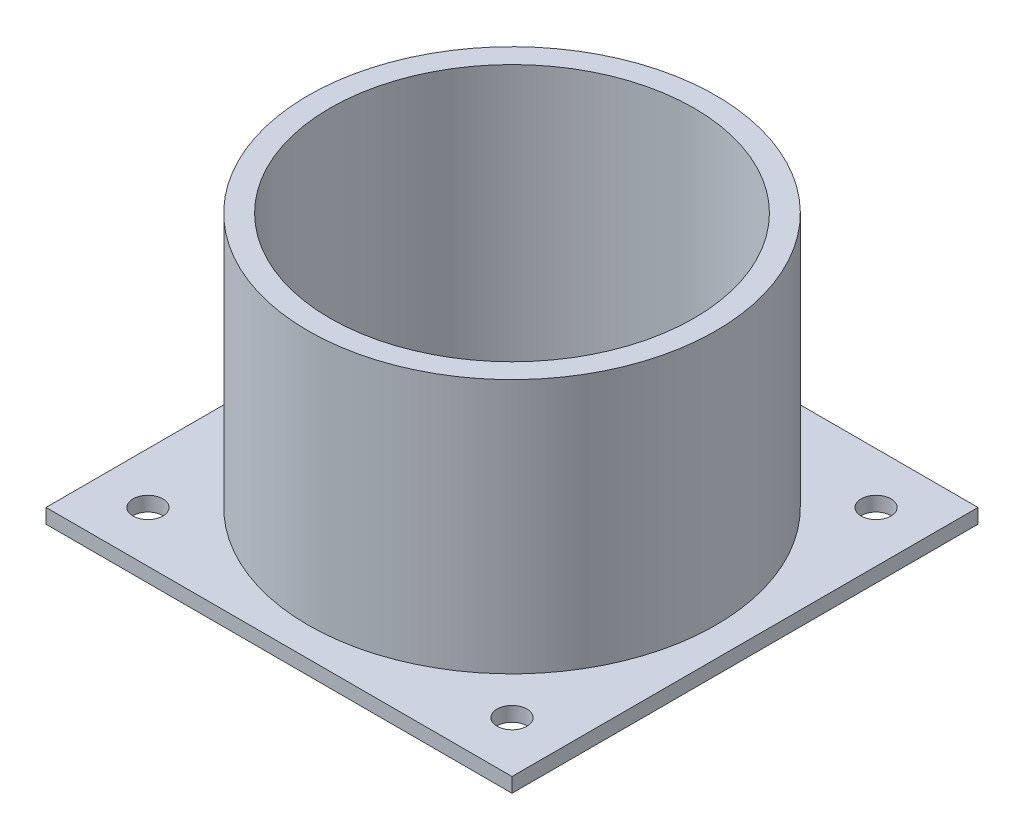
ISO-10303-21;
HEADER;
FILE_DESCRIPTION(('STEP AP214'),'2;1');
FILE_NAME('part.step','',(''),(''),'','','');
FILE_SCHEMA(('AUTOMOTIVE_DESIGN { 1 0 10303 214 1 1 1 1 }'));
ENDSEC;
DATA;
#1=APPLICATION_CONTEXT('core data for automotive mechanical design processes');
#2=APPLICATION_PROTOCOL_DEFINITION('international standard','automotive_design',2000,#1);
#3=PRODUCT_CONTEXT('',#1,'mechanical');
#4=PRODUCT('Part','Part','',(#3));
#5=PRODUCT_RELATED_PRODUCT_CATEGORY('part','',(#4));
#6=PRODUCT_DEFINITION_FORMATION('','',#4);
#7=PRODUCT_DEFINITION_CONTEXT('part definition',#1,'design');
#8=PRODUCT_DEFINITION('design','',#6,#7);
#9=PRODUCT_DEFINITION_SHAPE('','',#8);
#10=(LENGTH_UNIT() NAMED_UNIT(*) SI_UNIT(.MILLI.,.METRE.));
#11=(NAMED_UNIT(*) PLANE_ANGLE_UNIT() SI_UNIT($,.RADIAN.));
#12=(NAMED_UNIT(*) SI_UNIT($,.STERADIAN.) SOLID_ANGLE_UNIT());
#13=UNCERTAINTY_MEASURE_WITH_UNIT(LENGTH_MEASURE(1.E-05),#10,'distance_accuracy_value','');
#14=(GEOMETRIC_REPRESENTATION_CONTEXT(3) GLOBAL_UNCERTAINTY_ASSIGNED_CONTEXT((#13)) GLOBAL_UNIT_ASSIGNED_CONTEXT((#10,
#11,#12)) REPRESENTATION_CONTEXT('',''));
#15=CARTESIAN_POINT('',(0.,0.,0.));
#16=DIRECTION('',(0.,0.,1.));
#17=DIRECTION('',(1.,0.,0.));
#18=AXIS2_PLACEMENT_3D('',#15,#16,#17);
#19=CARTESIAN_POINT('',(0.,2.,0.));
#20=DIRECTION('',(0.,1.,0.));
#21=DIRECTION('',(0.,0.,1.));
#22=AXIS2_PLACEMENT_3D('',#19,#20,#21);
#23=PLANE('',#22);
#24=DIRECTION('',(0.,0.,1.));
#25=VECTOR('',#24,1.);
#26=CARTESIAN_POINT('',(-23.9240506329114,2.,-18.7160940325497));
#27=LINE('',#26,#25);
#28=CARTESIAN_POINT('',(-23.9240506329114,2.,-18.7160940325497));
#29=VERTEX_POINT('',#28);
#30=CARTESIAN_POINT('',(-23.9240506329114,2.,45.2839059674503));
#31=VERTEX_POINT('',#30);
#32=EDGE_CURVE('E116',#29,#31,#27,.T.);
#33=ORIENTED_EDGE('',*,*,#32,.T.);
#34=DIRECTION('',(1.,0.,0.));
#35=VECTOR('',#34,1.);
#36=CARTESIAN_POINT('',(-23.9240506329114,2.,45.2839059674503));
#37=LINE('',#36,#35);
#38=CARTESIAN_POINT('',(40.0759493670886,2.,45.2839059674503));
#39=VERTEX_POINT('',#38);
#40=EDGE_CURVE('E111',#31,#39,#37,.T.);
#41=ORIENTED_EDGE('',*,*,#40,.T.);
#42=DIRECTION('',(0.,0.,-1.));
#43=VECTOR('',#42,1.);
#44=CARTESIAN_POINT('',(40.0759493670886,2.,-18.7160940325497));
#45=LINE('',#44,#43);
#46=CARTESIAN_POINT('',(40.0759493670886,2.,-18.7160940325497));
#47=VERTEX_POINT('',#46);
#48=EDGE_CURVE('E114',#39,#47,#45,.T.);
#49=ORIENTED_EDGE('',*,*,#48,.T.);
#50=DIRECTION('',(-1.,0.,0.));
#51=VECTOR('',#50,1.);
#52=CARTESIAN_POINT('',(-23.9240506329114,2.,-18.7160940325497));
#53=LINE('',#52,#51);
#54=EDGE_CURVE('E81',#47,#29,#53,.T.);
#55=ORIENTED_EDGE('',*,*,#54,.T.);
#56=EDGE_LOOP('',(#33,#41,#49,#55));
#57=FACE_BOUND('',#56,.T.);
#58=CARTESIAN_POINT('',(-16.9240506329114,2.,-11.7160940325497));
#59=DIRECTION('',(0.,1.,0.));
#60=DIRECTION('',(0.,0.,1.));
#61=AXIS2_PLACEMENT_3D('',#58,#59,#60);
#62=CIRCLE('',#61,2.05);
#63=CARTESIAN_POINT('',(-16.9240506329114,2.,-9.66609403254968));
#64=VERTEX_POINT('',#63);
#65=EDGE_CURVE('E153',#64,#64,#62,.T.);
#66=ORIENTED_EDGE('',*,*,#65,.F.);
#67=EDGE_LOOP('',(#66));
#68=FACE_BOUND('',#67,.T.);
#69=CARTESIAN_POINT('',(33.0759493670886,2.,38.2839059674503));
#70=DIRECTION('',(0.,1.,0.));
#71=DIRECTION('',(0.,0.,1.));
#72=AXIS2_PLACEMENT_3D('',#69,#70,#71);
#73=CIRCLE('',#72,2.04999999999999);
#74=CARTESIAN_POINT('',(33.0759493670886,2.,40.3339059674503));
#75=VERTEX_POINT('',#74);
#76=EDGE_CURVE('E177',#75,#75,#73,.T.);
#77=ORIENTED_EDGE('',*,*,#76,.F.);
#78=EDGE_LOOP('',(#77));
#79=FACE_BOUND('',#78,.T.);
#80=CARTESIAN_POINT('',(33.0759493670886,2.,-11.7160940325497));
#81=DIRECTION('',(0.,1.,0.));
#82=DIRECTION('',(0.,0.,1.));
#83=AXIS2_PLACEMENT_3D('',#80,#81,#82);
#84=CIRCLE('',#83,2.04999999999999);
#85=CARTESIAN_POINT('',(33.0759493670886,2.,-9.6660940325497));
#86=VERTEX_POINT('',#85);
#87=EDGE_CURVE('E172',#86,#86,#84,.T.);
#88=ORIENTED_EDGE('',*,*,#87,.F.);
#89=EDGE_LOOP('',(#88));
#90=FACE_BOUND('',#89,.T.);
#91=CARTESIAN_POINT('',(-16.9240506329114,2.,38.2839059674503));
#92=DIRECTION('',(0.,1.,0.));
#93=DIRECTION('',(0.,0.,1.));
#94=AXIS2_PLACEMENT_3D('',#91,#92,#93);
#95=CIRCLE('',#94,2.05);
#96=CARTESIAN_POINT('',(-16.9240506329114,2.,40.3339059674503));
#97=VERTEX_POINT('',#96);
#98=EDGE_CURVE('E157',#97,#97,#95,.T.);
#99=ORIENTED_EDGE('',*,*,#98,.F.);
#100=EDGE_LOOP('',(#99));
#101=FACE_BOUND('',#100,.T.);
#102=CARTESIAN_POINT('',(8.07594936708862,2.,13.2839059674503));
#103=DIRECTION('',(0.,1.,0.));
#104=DIRECTION('',(0.,0.,1.));
#105=AXIS2_PLACEMENT_3D('',#102,#103,#104);
#106=CIRCLE('',#105,28.);
#107=CARTESIAN_POINT('',(8.07594936708862,2.,41.2839059674503));
#108=VERTEX_POINT('',#107);
#109=EDGE_CURVE('E189',#108,#108,#106,.T.);
#110=ORIENTED_EDGE('',*,*,#109,.F.);
#111=EDGE_LOOP('',(#110));
#112=FACE_BOUND('',#111,.T.);
#113=ADVANCED_FACE('F63',(#57,#68,#79,#90,#101,#112),#23,.T.);
#114=CARTESIAN_POINT('',(-23.9240506329114,2.,-18.7160940325497));
#115=DIRECTION('',(1.,0.,0.));
#116=DIRECTION('',(0.,0.,-1.));
#117=AXIS2_PLACEMENT_3D('',#114,#115,#116);
#118=PLANE('',#117);
#119=DIRECTION('',(0.,0.,1.));
#120=VECTOR('',#119,1.);
#121=CARTESIAN_POINT('',(-23.9240506329114,0.,-18.7160940325497));
#122=LINE('',#121,#120);
#123=CARTESIAN_POINT('',(-23.9240506329114,0.,-18.7160940325497));
#124=VERTEX_POINT('',#123);
#125=CARTESIAN_POINT('',(-23.9240506329114,0.,45.2839059674503));
#126=VERTEX_POINT('',#125);
#127=EDGE_CURVE('E132',#124,#126,#122,.T.);
#128=ORIENTED_EDGE('',*,*,#127,.T.);
#129=DIRECTION('',(0.,-1.,0.));
#130=VECTOR('',#129,1.);
#131=CARTESIAN_POINT('',(-23.9240506329114,2.,45.2839059674503));
#132=LINE('',#131,#130);
#133=EDGE_CURVE('E12',#31,#126,#132,.T.);
#134=ORIENTED_EDGE('',*,*,#133,.F.);
#135=ORIENTED_EDGE('',*,*,#32,.F.);
#136=DIRECTION('',(0.,-1.,0.));
#137=VECTOR('',#136,1.);
#138=CARTESIAN_POINT('',(-23.9240506329114,2.,-18.7160940325497));
#139=LINE('',#138,#137);
#140=EDGE_CURVE('E128',#29,#124,#139,.T.);
#141=ORIENTED_EDGE('',*,*,#140,.T.);
#142=EDGE_LOOP('',(#128,#134,#135,#141));
#143=FACE_BOUND('',#142,.T.);
#144=ADVANCED_FACE('F65',(#143),#118,.F.);
#145=CARTESIAN_POINT('',(-23.9240506329114,2.,45.2839059674503));
#146=DIRECTION('',(0.,0.,-1.));
#147=DIRECTION('',(-1.,0.,0.));
#148=AXIS2_PLACEMENT_3D('',#145,#146,#147);
#149=PLANE('',#148);
#150=DIRECTION('',(1.,0.,0.));
#151=VECTOR('',#150,1.);
#152=CARTESIAN_POINT('',(-23.9240506329114,0.,45.2839059674503));
#153=LINE('',#152,#151);
#154=CARTESIAN_POINT('',(40.0759493670886,0.,45.2839059674503));
#155=VERTEX_POINT('',#154);
#156=EDGE_CURVE('E121',#126,#155,#153,.T.);
#157=ORIENTED_EDGE('',*,*,#156,.T.);
#158=DIRECTION('',(0.,-1.,0.));
#159=VECTOR('',#158,1.);
#160=CARTESIAN_POINT('',(40.0759493670886,2.,45.2839059674503));
#161=LINE('',#160,#159);
#162=EDGE_CURVE('E73',#39,#155,#161,.T.);
#163=ORIENTED_EDGE('',*,*,#162,.F.);
#164=ORIENTED_EDGE('',*,*,#40,.F.);
#165=ORIENTED_EDGE('',*,*,#133,.T.);
#166=EDGE_LOOP('',(#157,#163,#164,#165));
#167=FACE_BOUND('',#166,.T.);
#168=ADVANCED_FACE('F120',(#167),#149,.F.);
#169=CARTESIAN_POINT('',(40.0759493670886,2.,-18.7160940325497));
#170=DIRECTION('',(-1.,0.,0.));
#171=DIRECTION('',(0.,0.,1.));
#172=AXIS2_PLACEMENT_3D('',#169,#170,#171);
#173=PLANE('',#172);
#174=DIRECTION('',(0.,0.,-1.));
#175=VECTOR('',#174,1.);
#176=CARTESIAN_POINT('',(40.0759493670886,0.,-18.7160940325497));
#177=LINE('',#176,#175);
#178=CARTESIAN_POINT('',(40.0759493670886,0.,-18.7160940325497));
#179=VERTEX_POINT('',#178);
#180=EDGE_CURVE('E98',#155,#179,#177,.T.);
#181=ORIENTED_EDGE('',*,*,#180,.T.);
#182=DIRECTION('',(0.,-1.,0.));
#183=VECTOR('',#182,1.);
#184=CARTESIAN_POINT('',(40.0759493670886,2.,-18.7160940325497));
#185=LINE('',#184,#183);
#186=EDGE_CURVE('E123',#47,#179,#185,.T.);
#187=ORIENTED_EDGE('',*,*,#186,.F.);
#188=ORIENTED_EDGE('',*,*,#48,.F.);
#189=ORIENTED_EDGE('',*,*,#162,.T.);
#190=EDGE_LOOP('',(#181,#187,#188,#189));
#191=FACE_BOUND('',#190,.T.);
#192=ADVANCED_FACE('F124',(#191),#173,.F.);
#193=CARTESIAN_POINT('',(-23.9240506329114,2.,-18.7160940325497));
#194=DIRECTION('',(0.,0.,1.));
#195=DIRECTION('',(1.,0.,0.));
#196=AXIS2_PLACEMENT_3D('',#193,#194,#195);
#197=PLANE('',#196);
#198=DIRECTION('',(-1.,0.,0.));
#199=VECTOR('',#198,1.);
#200=CARTESIAN_POINT('',(-23.9240506329114,0.,-18.7160940325497));
#201=LINE('',#200,#199);
#202=EDGE_CURVE('E104',#179,#124,#201,.T.);
#203=ORIENTED_EDGE('',*,*,#202,.T.);
#204=ORIENTED_EDGE('',*,*,#140,.F.);
#205=ORIENTED_EDGE('',*,*,#54,.F.);
#206=ORIENTED_EDGE('',*,*,#186,.T.);
#207=EDGE_LOOP('',(#203,#204,#205,#206));
#208=FACE_BOUND('',#207,.T.);
#209=ADVANCED_FACE('F146',(#208),#197,.F.);
#210=CARTESIAN_POINT('',(0.,0.,0.));
#211=DIRECTION('',(0.,1.,0.));
#212=DIRECTION('',(0.,0.,1.));
#213=AXIS2_PLACEMENT_3D('',#210,#211,#212);
#214=PLANE('',#213);
#215=CARTESIAN_POINT('',(8.07594936708862,0.,13.2839059674503));
#216=DIRECTION('',(0.,1.,0.));
#217=DIRECTION('',(0.,0.,1.));
#218=AXIS2_PLACEMENT_3D('',#215,#216,#217);
#219=CIRCLE('',#218,25.);
#220=CARTESIAN_POINT('',(8.07594936708862,0.,38.2839059674503));
#221=VERTEX_POINT('',#220);
#222=EDGE_CURVE('E165',#221,#221,#219,.T.);
#223=ORIENTED_EDGE('',*,*,#222,.T.);
#224=EDGE_LOOP('',(#223));
#225=FACE_BOUND('',#224,.T.);
#226=CARTESIAN_POINT('',(-16.9240506329114,0.,38.2839059674503));
#227=DIRECTION('',(0.,1.,0.));
#228=DIRECTION('',(0.,0.,1.));
#229=AXIS2_PLACEMENT_3D('',#226,#227,#228);
#230=CIRCLE('',#229,2.05);
#231=CARTESIAN_POINT('',(-16.9240506329114,0.,40.3339059674503));
#232=VERTEX_POINT('',#231);
#233=EDGE_CURVE('E161',#232,#232,#230,.T.);
#234=ORIENTED_EDGE('',*,*,#233,.T.);
#235=EDGE_LOOP('',(#234));
#236=FACE_BOUND('',#235,.T.);
#237=CARTESIAN_POINT('',(33.0759493670886,0.,-11.7160940325497));
#238=DIRECTION('',(0.,1.,0.));
#239=DIRECTION('',(0.,0.,1.));
#240=AXIS2_PLACEMENT_3D('',#237,#238,#239);
#241=CIRCLE('',#240,2.04999999999999);
#242=CARTESIAN_POINT('',(33.0759493670886,0.,-9.6660940325497));
#243=VERTEX_POINT('',#242);
#244=EDGE_CURVE('E182',#243,#243,#241,.T.);
#245=ORIENTED_EDGE('',*,*,#244,.T.);
#246=EDGE_LOOP('',(#245));
#247=FACE_BOUND('',#246,.T.);
#248=CARTESIAN_POINT('',(33.0759493670886,0.,38.2839059674503));
#249=DIRECTION('',(0.,1.,0.));
#250=DIRECTION('',(0.,0.,1.));
#251=AXIS2_PLACEMENT_3D('',#248,#249,#250);
#252=CIRCLE('',#251,2.04999999999999);
#253=CARTESIAN_POINT('',(33.0759493670886,0.,40.3339059674503));
#254=VERTEX_POINT('',#253);
#255=EDGE_CURVE('E173',#254,#254,#252,.T.);
#256=ORIENTED_EDGE('',*,*,#255,.T.);
#257=EDGE_LOOP('',(#256));
#258=FACE_BOUND('',#257,.T.);
#259=CARTESIAN_POINT('',(-16.9240506329114,0.,-11.7160940325497));
#260=DIRECTION('',(0.,1.,0.));
#261=DIRECTION('',(0.,0.,1.));
#262=AXIS2_PLACEMENT_3D('',#259,#260,#261);
#263=CIRCLE('',#262,2.05);
#264=CARTESIAN_POINT('',(-16.9240506329114,0.,-9.66609403254968));
#265=VERTEX_POINT('',#264);
#266=EDGE_CURVE('E136',#265,#265,#263,.T.);
#267=ORIENTED_EDGE('',*,*,#266,.T.);
#268=EDGE_LOOP('',(#267));
#269=FACE_BOUND('',#268,.T.);
#270=ORIENTED_EDGE('',*,*,#127,.F.);
#271=ORIENTED_EDGE('',*,*,#202,.F.);
#272=ORIENTED_EDGE('',*,*,#180,.F.);
#273=ORIENTED_EDGE('',*,*,#156,.F.);
#274=EDGE_LOOP('',(#270,#271,#272,#273));
#275=FACE_BOUND('',#274,.T.);
#276=ADVANCED_FACE('F149',(#225,#236,#247,#258,#269,#275),#214,.F.);
#277=CARTESIAN_POINT('',(-16.9240506329114,0.,-11.7160940325497));
#278=DIRECTION('',(0.,1.,0.));
#279=DIRECTION('',(0.,0.,1.));
#280=AXIS2_PLACEMENT_3D('',#277,#278,#279);
#281=CYLINDRICAL_SURFACE('',#280,2.05);
#282=ORIENTED_EDGE('',*,*,#266,.F.);
#283=EDGE_LOOP('',(#282));
#284=FACE_BOUND('',#283,.T.);
#285=ORIENTED_EDGE('',*,*,#65,.T.);
#286=EDGE_LOOP('',(#285));
#287=FACE_BOUND('',#286,.T.);
#288=ADVANCED_FACE('F224',(#284,#287),#281,.F.);
#289=CARTESIAN_POINT('',(33.0759493670886,0.,38.2839059674503));
#290=DIRECTION('',(0.,1.,0.));
#291=DIRECTION('',(0.,0.,1.));
#292=AXIS2_PLACEMENT_3D('',#289,#290,#291);
#293=CYLINDRICAL_SURFACE('',#292,2.04999999999999);
#294=ORIENTED_EDGE('',*,*,#255,.F.);
#295=EDGE_LOOP('',(#294));
#296=FACE_BOUND('',#295,.T.);
#297=ORIENTED_EDGE('',*,*,#76,.T.);
#298=EDGE_LOOP('',(#297));
#299=FACE_BOUND('',#298,.T.);
#300=ADVANCED_FACE('F255',(#296,#299),#293,.F.);
#301=CARTESIAN_POINT('',(33.0759493670886,0.,-11.7160940325497));
#302=DIRECTION('',(0.,1.,0.));
#303=DIRECTION('',(0.,0.,1.));
#304=AXIS2_PLACEMENT_3D('',#301,#302,#303);
#305=CYLINDRICAL_SURFACE('',#304,2.04999999999999);
#306=ORIENTED_EDGE('',*,*,#244,.F.);
#307=EDGE_LOOP('',(#306));
#308=FACE_BOUND('',#307,.T.);
#309=ORIENTED_EDGE('',*,*,#87,.T.);
#310=EDGE_LOOP('',(#309));
#311=FACE_BOUND('',#310,.T.);
#312=ADVANCED_FACE('F262',(#308,#311),#305,.F.);
#313=CARTESIAN_POINT('',(-16.9240506329114,0.,38.2839059674503));
#314=DIRECTION('',(0.,1.,0.));
#315=DIRECTION('',(0.,0.,1.));
#316=AXIS2_PLACEMENT_3D('',#313,#314,#315);
#317=CYLINDRICAL_SURFACE('',#316,2.05);
#318=ORIENTED_EDGE('',*,*,#233,.F.);
#319=EDGE_LOOP('',(#318));
#320=FACE_BOUND('',#319,.T.);
#321=ORIENTED_EDGE('',*,*,#98,.T.);
#322=EDGE_LOOP('',(#321));
#323=FACE_BOUND('',#322,.T.);
#324=ADVANCED_FACE('F214',(#320,#323),#317,.F.);
#325=CARTESIAN_POINT('',(8.07594936708862,0.,13.2839059674503));
#326=DIRECTION('',(0.,1.,0.));
#327=DIRECTION('',(0.,0.,1.));
#328=AXIS2_PLACEMENT_3D('',#325,#326,#327);
#329=CYLINDRICAL_SURFACE('',#328,25.);
#330=ORIENTED_EDGE('',*,*,#222,.F.);
#331=EDGE_LOOP('',(#330));
#332=FACE_BOUND('',#331,.T.);
#333=CARTESIAN_POINT('',(8.07594936708862,37.,13.2839059674503));
#334=DIRECTION('',(0.,1.,0.));
#335=DIRECTION('',(0.,0.,1.));
#336=AXIS2_PLACEMENT_3D('',#333,#334,#335);
#337=CIRCLE('',#336,25.);
#338=CARTESIAN_POINT('',(8.07594936708862,37.,38.2839059674503));
#339=VERTEX_POINT('',#338);
#340=EDGE_CURVE('E193',#339,#339,#337,.T.);
#341=ORIENTED_EDGE('',*,*,#340,.T.);
#342=EDGE_LOOP('',(#341));
#343=FACE_BOUND('',#342,.T.);
#344=ADVANCED_FACE('F201',(#332,#343),#329,.F.);
#345=CARTESIAN_POINT('',(8.07594936708862,37.,13.2839059674503));
#346=DIRECTION('',(0.,1.,0.));
#347=DIRECTION('',(0.,0.,1.));
#348=AXIS2_PLACEMENT_3D('',#345,#346,#347);
#349=PLANE('',#348);
#350=CARTESIAN_POINT('',(8.07594936708862,37.,13.2839059674503));
#351=DIRECTION('',(0.,1.,0.));
#352=DIRECTION('',(0.,0.,1.));
#353=AXIS2_PLACEMENT_3D('',#350,#351,#352);
#354=CIRCLE('',#353,28.);
#355=CARTESIAN_POINT('',(8.07594936708862,37.,41.2839059674503));
#356=VERTEX_POINT('',#355);
#357=EDGE_CURVE('E178',#356,#356,#354,.T.);
#358=ORIENTED_EDGE('',*,*,#357,.T.);
#359=EDGE_LOOP('',(#358));
#360=FACE_BOUND('',#359,.T.);
#361=ORIENTED_EDGE('',*,*,#340,.F.);
#362=EDGE_LOOP('',(#361));
#363=FACE_BOUND('',#362,.T.);
#364=ADVANCED_FACE('F203',(#360,#363),#349,.T.);
#365=CARTESIAN_POINT('',(8.07594936708862,37.,13.2839059674503));
#366=DIRECTION('',(0.,-1.,0.));
#367=DIRECTION('',(0.,0.,-1.));
#368=AXIS2_PLACEMENT_3D('',#365,#366,#367);
#369=CYLINDRICAL_SURFACE('',#368,28.);
#370=ORIENTED_EDGE('',*,*,#357,.F.);
#371=EDGE_LOOP('',(#370));
#372=FACE_BOUND('',#371,.T.);
#373=ORIENTED_EDGE('',*,*,#109,.T.);
#374=EDGE_LOOP('',(#373));
#375=FACE_BOUND('',#374,.T.);
#376=ADVANCED_FACE('F205',(#372,#375),#369,.T.);
#377=CLOSED_SHELL('',(#113,#144,#168,#192,#209,#276,#288,#300,#312,#324,#344,#364,#376));
#378=MANIFOLD_SOLID_BREP('B2',#377);
#379=ADVANCED_BREP_SHAPE_REPRESENTATION('',(#18,#378),#14);
#380=SHAPE_DEFINITION_REPRESENTATION(#9,#379);
ENDSEC;
END-ISO-10303-21;
